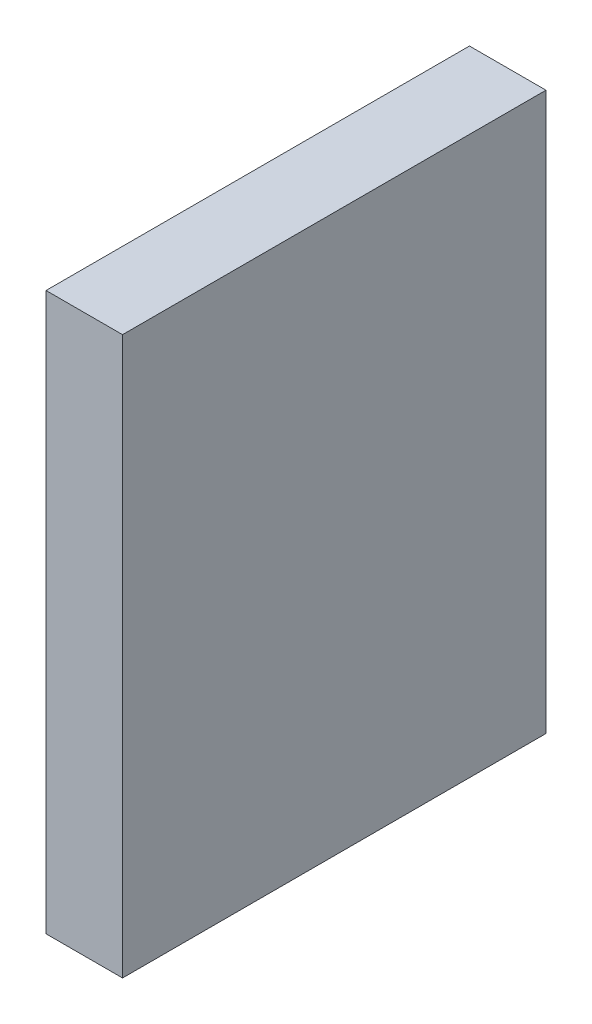
ISO-10303-21;
HEADER;
FILE_DESCRIPTION(('STEP AP214'),'2;1');
FILE_NAME('part.step','',(''),(''),'','','');
FILE_SCHEMA(('AUTOMOTIVE_DESIGN { 1 0 10303 214 1 1 1 1 }'));
ENDSEC;
DATA;
#1=APPLICATION_CONTEXT('core data for automotive mechanical design processes');
#2=APPLICATION_PROTOCOL_DEFINITION('international standard','automotive_design',2000,#1);
#3=PRODUCT_CONTEXT('',#1,'mechanical');
#4=PRODUCT('Part','Part','',(#3));
#5=PRODUCT_RELATED_PRODUCT_CATEGORY('part','',(#4));
#6=PRODUCT_DEFINITION_FORMATION('','',#4);
#7=PRODUCT_DEFINITION_CONTEXT('part definition',#1,'design');
#8=PRODUCT_DEFINITION('design','',#6,#7);
#9=PRODUCT_DEFINITION_SHAPE('','',#8);
#10=(LENGTH_UNIT() NAMED_UNIT(*) SI_UNIT(.MILLI.,.METRE.));
#11=(NAMED_UNIT(*) PLANE_ANGLE_UNIT() SI_UNIT($,.RADIAN.));
#12=(NAMED_UNIT(*) SI_UNIT($,.STERADIAN.) SOLID_ANGLE_UNIT());
#13=UNCERTAINTY_MEASURE_WITH_UNIT(LENGTH_MEASURE(1.E-05),#10,'distance_accuracy_value','');
#14=(GEOMETRIC_REPRESENTATION_CONTEXT(3) GLOBAL_UNCERTAINTY_ASSIGNED_CONTEXT((#13)) GLOBAL_UNIT_ASSIGNED_CONTEXT((#10,
#11,#12)) REPRESENTATION_CONTEXT('',''));
#15=CARTESIAN_POINT('',(0.,0.,0.));
#16=DIRECTION('',(0.,0.,1.));
#17=DIRECTION('',(1.,0.,0.));
#18=AXIS2_PLACEMENT_3D('',#15,#16,#17);
#19=CARTESIAN_POINT('',(-107.512887045066,75.,-16.0571550711005));
#20=DIRECTION('',(1.,0.,0.));
#21=DIRECTION('',(0.,0.,-1.));
#22=AXIS2_PLACEMENT_3D('',#19,#20,#21);
#23=PLANE('',#22);
#24=DIRECTION('',(0.,-1.,0.));
#25=VECTOR('',#24,1.);
#26=CARTESIAN_POINT('',(-107.512887045066,0.,0.));
#27=LINE('',#26,#25);
#28=CARTESIAN_POINT('',(-107.512887045066,75.,0.));
#29=VERTEX_POINT('',#28);
#30=CARTESIAN_POINT('',(-107.512887045066,-75.,0.));
#31=VERTEX_POINT('',#30);
#32=EDGE_CURVE('E68',#29,#31,#27,.T.);
#33=ORIENTED_EDGE('',*,*,#32,.T.);
#34=DIRECTION('',(0.,0.,1.));
#35=VECTOR('',#34,1.);
#36=CARTESIAN_POINT('',(-107.512887045066,-75.,-16.0571550711005));
#37=LINE('',#36,#35);
#38=CARTESIAN_POINT('',(-107.512887045066,-75.,114.));
#39=VERTEX_POINT('',#38);
#40=EDGE_CURVE('E42',#31,#39,#37,.T.);
#41=ORIENTED_EDGE('',*,*,#40,.T.);
#42=DIRECTION('',(0.,-1.,0.));
#43=VECTOR('',#42,1.);
#44=CARTESIAN_POINT('',(-107.512887045066,0.,114.));
#45=LINE('',#44,#43);
#46=CARTESIAN_POINT('',(-107.512887045066,75.,114.));
#47=VERTEX_POINT('',#46);
#48=EDGE_CURVE('E94',#47,#39,#45,.T.);
#49=ORIENTED_EDGE('',*,*,#48,.F.);
#50=DIRECTION('',(0.,0.,1.));
#51=VECTOR('',#50,1.);
#52=CARTESIAN_POINT('',(-107.512887045066,75.,-16.0571550711005));
#53=LINE('',#52,#51);
#54=EDGE_CURVE('E101',#29,#47,#53,.T.);
#55=ORIENTED_EDGE('',*,*,#54,.F.);
#56=EDGE_LOOP('',(#33,#41,#49,#55));
#57=FACE_BOUND('',#56,.T.);
#58=ADVANCED_FACE('F34',(#57),#23,.F.);
#59=CARTESIAN_POINT('',(0.,0.,114.));
#60=DIRECTION('',(0.,0.,-1.));
#61=DIRECTION('',(-1.,0.,0.));
#62=AXIS2_PLACEMENT_3D('',#59,#60,#61);
#63=PLANE('',#62);
#64=DIRECTION('',(1.,0.,0.));
#65=VECTOR('',#64,1.);
#66=CARTESIAN_POINT('',(-125.,-75.,114.));
#67=LINE('',#66,#65);
#68=CARTESIAN_POINT('',(-86.910976648008,-75.,114.));
#69=VERTEX_POINT('',#68);
#70=EDGE_CURVE('E87',#39,#69,#67,.T.);
#71=ORIENTED_EDGE('',*,*,#70,.T.);
#72=DIRECTION('',(0.,1.,0.));
#73=VECTOR('',#72,1.);
#74=CARTESIAN_POINT('',(-86.910976648008,0.,114.));
#75=LINE('',#74,#73);
#76=CARTESIAN_POINT('',(-86.910976648008,75.,114.));
#77=VERTEX_POINT('',#76);
#78=EDGE_CURVE('E11',#69,#77,#75,.T.);
#79=ORIENTED_EDGE('',*,*,#78,.T.);
#80=DIRECTION('',(-1.,0.,0.));
#81=VECTOR('',#80,1.);
#82=CARTESIAN_POINT('',(-125.,75.,114.));
#83=LINE('',#82,#81);
#84=EDGE_CURVE('E97',#77,#47,#83,.T.);
#85=ORIENTED_EDGE('',*,*,#84,.T.);
#86=ORIENTED_EDGE('',*,*,#48,.T.);
#87=EDGE_LOOP('',(#71,#79,#85,#86));
#88=FACE_BOUND('',#87,.T.);
#89=ADVANCED_FACE('F92',(#88),#63,.F.);
#90=CARTESIAN_POINT('',(-125.,75.,114.));
#91=DIRECTION('',(0.,-1.,0.));
#92=DIRECTION('',(0.,0.,-1.));
#93=AXIS2_PLACEMENT_3D('',#90,#91,#92);
#94=PLANE('',#93);
#95=ORIENTED_EDGE('',*,*,#84,.F.);
#96=DIRECTION('',(0.,0.,-1.));
#97=VECTOR('',#96,1.);
#98=CARTESIAN_POINT('',(-86.910976648008,75.,-16.0571550711005));
#99=LINE('',#98,#97);
#100=CARTESIAN_POINT('',(-86.910976648008,75.,0.));
#101=VERTEX_POINT('',#100);
#102=EDGE_CURVE('E49',#77,#101,#99,.T.);
#103=ORIENTED_EDGE('',*,*,#102,.T.);
#104=DIRECTION('',(-1.,0.,0.));
#105=VECTOR('',#104,1.);
#106=CARTESIAN_POINT('',(-125.,75.,0.));
#107=LINE('',#106,#105);
#108=EDGE_CURVE('E56',#101,#29,#107,.T.);
#109=ORIENTED_EDGE('',*,*,#108,.T.);
#110=ORIENTED_EDGE('',*,*,#54,.T.);
#111=EDGE_LOOP('',(#95,#103,#109,#110));
#112=FACE_BOUND('',#111,.T.);
#113=ADVANCED_FACE('F104',(#112),#94,.F.);
#114=CARTESIAN_POINT('',(0.,0.,0.));
#115=DIRECTION('',(0.,0.,-1.));
#116=DIRECTION('',(-1.,0.,0.));
#117=AXIS2_PLACEMENT_3D('',#114,#115,#116);
#118=PLANE('',#117);
#119=DIRECTION('',(0.,1.,0.));
#120=VECTOR('',#119,1.);
#121=CARTESIAN_POINT('',(-86.910976648008,0.,0.));
#122=LINE('',#121,#120);
#123=CARTESIAN_POINT('',(-86.910976648008,-75.,0.));
#124=VERTEX_POINT('',#123);
#125=EDGE_CURVE('E74',#124,#101,#122,.T.);
#126=ORIENTED_EDGE('',*,*,#125,.F.);
#127=DIRECTION('',(1.,0.,0.));
#128=VECTOR('',#127,1.);
#129=CARTESIAN_POINT('',(-125.,-75.,0.));
#130=LINE('',#129,#128);
#131=EDGE_CURVE('E89',#31,#124,#130,.T.);
#132=ORIENTED_EDGE('',*,*,#131,.F.);
#133=ORIENTED_EDGE('',*,*,#32,.F.);
#134=ORIENTED_EDGE('',*,*,#108,.F.);
#135=EDGE_LOOP('',(#126,#132,#133,#134));
#136=FACE_BOUND('',#135,.T.);
#137=ADVANCED_FACE('F106',(#136),#118,.T.);
#138=CARTESIAN_POINT('',(-125.,-75.,114.));
#139=DIRECTION('',(0.,1.,0.));
#140=DIRECTION('',(0.,0.,1.));
#141=AXIS2_PLACEMENT_3D('',#138,#139,#140);
#142=PLANE('',#141);
#143=ORIENTED_EDGE('',*,*,#131,.T.);
#144=DIRECTION('',(0.,0.,-1.));
#145=VECTOR('',#144,1.);
#146=CARTESIAN_POINT('',(-86.910976648008,-75.,-16.0571550711005));
#147=LINE('',#146,#145);
#148=EDGE_CURVE('E80',#69,#124,#147,.T.);
#149=ORIENTED_EDGE('',*,*,#148,.F.);
#150=ORIENTED_EDGE('',*,*,#70,.F.);
#151=ORIENTED_EDGE('',*,*,#40,.F.);
#152=EDGE_LOOP('',(#143,#149,#150,#151));
#153=FACE_BOUND('',#152,.T.);
#154=ADVANCED_FACE('F36',(#153),#142,.F.);
#155=CARTESIAN_POINT('',(-86.910976648008,75.,-16.0571550711005));
#156=DIRECTION('',(-1.,0.,0.));
#157=DIRECTION('',(0.,0.,1.));
#158=AXIS2_PLACEMENT_3D('',#155,#156,#157);
#159=PLANE('',#158);
#160=ORIENTED_EDGE('',*,*,#125,.T.);
#161=ORIENTED_EDGE('',*,*,#102,.F.);
#162=ORIENTED_EDGE('',*,*,#78,.F.);
#163=ORIENTED_EDGE('',*,*,#148,.T.);
#164=EDGE_LOOP('',(#160,#161,#162,#163));
#165=FACE_BOUND('',#164,.T.);
#166=ADVANCED_FACE('F79',(#165),#159,.F.);
#167=CLOSED_SHELL('',(#58,#89,#113,#137,#154,#166));
#168=MANIFOLD_SOLID_BREP('B2',#167);
#169=ADVANCED_BREP_SHAPE_REPRESENTATION('',(#18,#168),#14);
#170=SHAPE_DEFINITION_REPRESENTATION(#9,#169);
ENDSEC;
END-ISO-10303-21;
